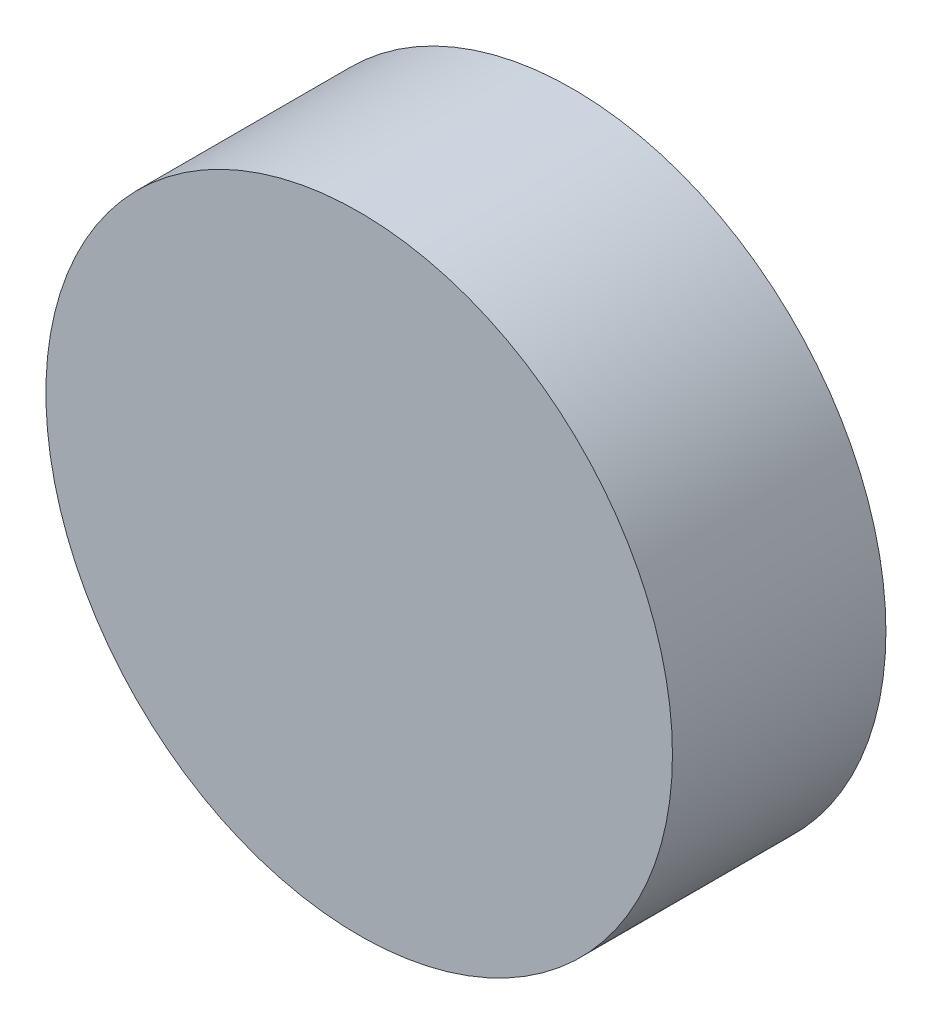
ISO-10303-21;
HEADER;
FILE_DESCRIPTION(('STEP AP214'),'2;1');
FILE_NAME('part.step','',(''),(''),'','','');
FILE_SCHEMA(('AUTOMOTIVE_DESIGN { 1 0 10303 214 1 1 1 1 }'));
ENDSEC;
DATA;
#1=APPLICATION_CONTEXT('core data for automotive mechanical design processes');
#2=APPLICATION_PROTOCOL_DEFINITION('international standard','automotive_design',2000,#1);
#3=PRODUCT_CONTEXT('',#1,'mechanical');
#4=PRODUCT('Part','Part','',(#3));
#5=PRODUCT_RELATED_PRODUCT_CATEGORY('part','',(#4));
#6=PRODUCT_DEFINITION_FORMATION('','',#4);
#7=PRODUCT_DEFINITION_CONTEXT('part definition',#1,'design');
#8=PRODUCT_DEFINITION('design','',#6,#7);
#9=PRODUCT_DEFINITION_SHAPE('','',#8);
#10=(LENGTH_UNIT() NAMED_UNIT(*) SI_UNIT(.MILLI.,.METRE.));
#11=(NAMED_UNIT(*) PLANE_ANGLE_UNIT() SI_UNIT($,.RADIAN.));
#12=(NAMED_UNIT(*) SI_UNIT($,.STERADIAN.) SOLID_ANGLE_UNIT());
#13=UNCERTAINTY_MEASURE_WITH_UNIT(LENGTH_MEASURE(1.E-05),#10,'distance_accuracy_value','');
#14=(GEOMETRIC_REPRESENTATION_CONTEXT(3) GLOBAL_UNCERTAINTY_ASSIGNED_CONTEXT((#13)) GLOBAL_UNIT_ASSIGNED_CONTEXT((#10,
#11,#12)) REPRESENTATION_CONTEXT('',''));
#15=CARTESIAN_POINT('',(0.,0.,0.));
#16=DIRECTION('',(0.,0.,1.));
#17=DIRECTION('',(1.,0.,0.));
#18=AXIS2_PLACEMENT_3D('',#15,#16,#17);
#19=CARTESIAN_POINT('',(0.,0.,20.));
#20=DIRECTION('',(0.,0.,-1.));
#21=DIRECTION('',(-1.,0.,0.));
#22=AXIS2_PLACEMENT_3D('',#19,#20,#21);
#23=CYLINDRICAL_SURFACE('',#22,29.3506572211758);
#24=CARTESIAN_POINT('',(0.,0.,20.));
#25=DIRECTION('',(0.,0.,1.));
#26=DIRECTION('',(1.,0.,0.));
#27=AXIS2_PLACEMENT_3D('',#24,#25,#26);
#28=CIRCLE('',#27,29.3506572211758);
#29=CARTESIAN_POINT('',(29.3506572211758,0.,20.));
#30=VERTEX_POINT('',#29);
#31=EDGE_CURVE('E10',#30,#30,#28,.T.);
#32=ORIENTED_EDGE('',*,*,#31,.F.);
#33=EDGE_LOOP('',(#32));
#34=FACE_BOUND('',#33,.T.);
#35=CARTESIAN_POINT('',(0.,0.,0.));
#36=DIRECTION('',(0.,0.,1.));
#37=DIRECTION('',(1.,0.,0.));
#38=AXIS2_PLACEMENT_3D('',#35,#36,#37);
#39=CIRCLE('',#38,29.3506572211758);
#40=CARTESIAN_POINT('',(29.3506572211758,0.,0.));
#41=VERTEX_POINT('',#40);
#42=EDGE_CURVE('E44',#41,#41,#39,.T.);
#43=ORIENTED_EDGE('',*,*,#42,.T.);
#44=EDGE_LOOP('',(#43));
#45=FACE_BOUND('',#44,.T.);
#46=ADVANCED_FACE('F41',(#34,#45),#23,.T.);
#47=CARTESIAN_POINT('',(0.,0.,20.));
#48=DIRECTION('',(0.,0.,1.));
#49=DIRECTION('',(1.,0.,0.));
#50=AXIS2_PLACEMENT_3D('',#47,#48,#49);
#51=PLANE('',#50);
#52=ORIENTED_EDGE('',*,*,#31,.T.);
#53=EDGE_LOOP('',(#52));
#54=FACE_BOUND('',#53,.T.);
#55=ADVANCED_FACE('F56',(#54),#51,.T.);
#56=CARTESIAN_POINT('',(0.,0.,0.));
#57=DIRECTION('',(0.,0.,1.));
#58=DIRECTION('',(1.,0.,0.));
#59=AXIS2_PLACEMENT_3D('',#56,#57,#58);
#60=PLANE('',#59);
#61=ORIENTED_EDGE('',*,*,#42,.F.);
#62=EDGE_LOOP('',(#61));
#63=FACE_BOUND('',#62,.T.);
#64=ADVANCED_FACE('F54',(#63),#60,.F.);
#65=CLOSED_SHELL('',(#46,#55,#64));
#66=MANIFOLD_SOLID_BREP('B2',#65);
#67=ADVANCED_BREP_SHAPE_REPRESENTATION('',(#18,#66),#14);
#68=SHAPE_DEFINITION_REPRESENTATION(#9,#67);
ENDSEC;
END-ISO-10303-21;
